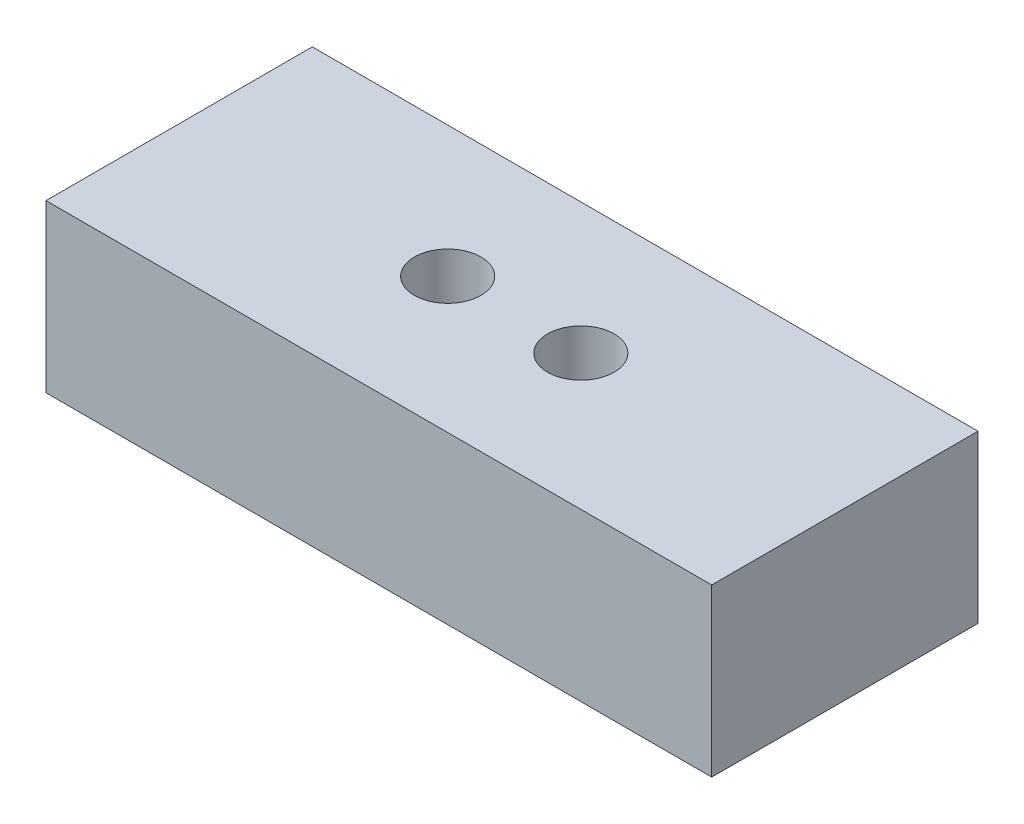
ISO-10303-21;
HEADER;
FILE_DESCRIPTION(('STEP AP214'),'2;1');
FILE_NAME('part.step','',(''),(''),'','','');
FILE_SCHEMA(('AUTOMOTIVE_DESIGN { 1 0 10303 214 1 1 1 1 }'));
ENDSEC;
DATA;
#1=APPLICATION_CONTEXT('core data for automotive mechanical design processes');
#2=APPLICATION_PROTOCOL_DEFINITION('international standard','automotive_design',2000,#1);
#3=PRODUCT_CONTEXT('',#1,'mechanical');
#4=PRODUCT('Part','Part','',(#3));
#5=PRODUCT_RELATED_PRODUCT_CATEGORY('part','',(#4));
#6=PRODUCT_DEFINITION_FORMATION('','',#4);
#7=PRODUCT_DEFINITION_CONTEXT('part definition',#1,'design');
#8=PRODUCT_DEFINITION('design','',#6,#7);
#9=PRODUCT_DEFINITION_SHAPE('','',#8);
#10=(LENGTH_UNIT() NAMED_UNIT(*) SI_UNIT(.MILLI.,.METRE.));
#11=(NAMED_UNIT(*) PLANE_ANGLE_UNIT() SI_UNIT($,.RADIAN.));
#12=(NAMED_UNIT(*) SI_UNIT($,.STERADIAN.) SOLID_ANGLE_UNIT());
#13=UNCERTAINTY_MEASURE_WITH_UNIT(LENGTH_MEASURE(1.E-05),#10,'distance_accuracy_value','');
#14=(GEOMETRIC_REPRESENTATION_CONTEXT(3) GLOBAL_UNCERTAINTY_ASSIGNED_CONTEXT((#13)) GLOBAL_UNIT_ASSIGNED_CONTEXT((#10,
#11,#12)) REPRESENTATION_CONTEXT('',''));
#15=CARTESIAN_POINT('',(0.,0.,0.));
#16=DIRECTION('',(0.,0.,1.));
#17=DIRECTION('',(1.,0.,0.));
#18=AXIS2_PLACEMENT_3D('',#15,#16,#17);
#19=CARTESIAN_POINT('',(-95.886524822695,25.,-18.2978723404255));
#20=DIRECTION('',(1.,0.,0.));
#21=DIRECTION('',(0.,0.,-1.));
#22=AXIS2_PLACEMENT_3D('',#19,#20,#21);
#23=PLANE('',#22);
#24=DIRECTION('',(0.,0.,1.));
#25=VECTOR('',#24,1.);
#26=CARTESIAN_POINT('',(-95.886524822695,0.,-18.2978723404255));
#27=LINE('',#26,#25);
#28=CARTESIAN_POINT('',(-95.886524822695,0.,-18.2978723404255));
#29=VERTEX_POINT('',#28);
#30=CARTESIAN_POINT('',(-95.886524822695,0.,21.7021276595745));
#31=VERTEX_POINT('',#30);
#32=EDGE_CURVE('E110',#29,#31,#27,.T.);
#33=ORIENTED_EDGE('',*,*,#32,.T.);
#34=DIRECTION('',(0.,-1.,0.));
#35=VECTOR('',#34,1.);
#36=CARTESIAN_POINT('',(-95.886524822695,25.,21.7021276595745));
#37=LINE('',#36,#35);
#38=CARTESIAN_POINT('',(-95.886524822695,25.,21.7021276595745));
#39=VERTEX_POINT('',#38);
#40=EDGE_CURVE('E11',#39,#31,#37,.T.);
#41=ORIENTED_EDGE('',*,*,#40,.F.);
#42=DIRECTION('',(0.,0.,1.));
#43=VECTOR('',#42,1.);
#44=CARTESIAN_POINT('',(-95.886524822695,25.,-18.2978723404255));
#45=LINE('',#44,#43);
#46=CARTESIAN_POINT('',(-95.886524822695,25.,-18.2978723404255));
#47=VERTEX_POINT('',#46);
#48=EDGE_CURVE('E94',#47,#39,#45,.T.);
#49=ORIENTED_EDGE('',*,*,#48,.F.);
#50=DIRECTION('',(0.,-1.,0.));
#51=VECTOR('',#50,1.);
#52=CARTESIAN_POINT('',(-95.886524822695,25.,-18.2978723404255));
#53=LINE('',#52,#51);
#54=EDGE_CURVE('E106',#47,#29,#53,.T.);
#55=ORIENTED_EDGE('',*,*,#54,.T.);
#56=EDGE_LOOP('',(#33,#41,#49,#55));
#57=FACE_BOUND('',#56,.T.);
#58=ADVANCED_FACE('F42',(#57),#23,.F.);
#59=CARTESIAN_POINT('',(-95.886524822695,25.,21.7021276595745));
#60=DIRECTION('',(0.,0.,-1.));
#61=DIRECTION('',(-1.,0.,0.));
#62=AXIS2_PLACEMENT_3D('',#59,#60,#61);
#63=PLANE('',#62);
#64=DIRECTION('',(1.,0.,0.));
#65=VECTOR('',#64,1.);
#66=CARTESIAN_POINT('',(-95.886524822695,0.,21.7021276595745));
#67=LINE('',#66,#65);
#68=CARTESIAN_POINT('',(4.11347517730497,0.,21.7021276595745));
#69=VERTEX_POINT('',#68);
#70=EDGE_CURVE('E99',#31,#69,#67,.T.);
#71=ORIENTED_EDGE('',*,*,#70,.T.);
#72=DIRECTION('',(0.,-1.,0.));
#73=VECTOR('',#72,1.);
#74=CARTESIAN_POINT('',(4.11347517730497,25.,21.7021276595745));
#75=LINE('',#74,#73);
#76=CARTESIAN_POINT('',(4.11347517730497,25.,21.7021276595745));
#77=VERTEX_POINT('',#76);
#78=EDGE_CURVE('E51',#77,#69,#75,.T.);
#79=ORIENTED_EDGE('',*,*,#78,.F.);
#80=DIRECTION('',(1.,0.,0.));
#81=VECTOR('',#80,1.);
#82=CARTESIAN_POINT('',(-95.886524822695,25.,21.7021276595745));
#83=LINE('',#82,#81);
#84=EDGE_CURVE('E89',#39,#77,#83,.T.);
#85=ORIENTED_EDGE('',*,*,#84,.F.);
#86=ORIENTED_EDGE('',*,*,#40,.T.);
#87=EDGE_LOOP('',(#71,#79,#85,#86));
#88=FACE_BOUND('',#87,.T.);
#89=ADVANCED_FACE('F98',(#88),#63,.F.);
#90=CARTESIAN_POINT('',(4.11347517730497,25.,-18.2978723404255));
#91=DIRECTION('',(-1.,0.,0.));
#92=DIRECTION('',(0.,0.,1.));
#93=AXIS2_PLACEMENT_3D('',#90,#91,#92);
#94=PLANE('',#93);
#95=DIRECTION('',(0.,0.,-1.));
#96=VECTOR('',#95,1.);
#97=CARTESIAN_POINT('',(4.11347517730497,0.,-18.2978723404255));
#98=LINE('',#97,#96);
#99=CARTESIAN_POINT('',(4.11347517730497,0.,-18.2978723404255));
#100=VERTEX_POINT('',#99);
#101=EDGE_CURVE('E76',#69,#100,#98,.T.);
#102=ORIENTED_EDGE('',*,*,#101,.T.);
#103=DIRECTION('',(0.,-1.,0.));
#104=VECTOR('',#103,1.);
#105=CARTESIAN_POINT('',(4.11347517730497,25.,-18.2978723404255));
#106=LINE('',#105,#104);
#107=CARTESIAN_POINT('',(4.11347517730497,25.,-18.2978723404255));
#108=VERTEX_POINT('',#107);
#109=EDGE_CURVE('E101',#108,#100,#106,.T.);
#110=ORIENTED_EDGE('',*,*,#109,.F.);
#111=DIRECTION('',(0.,0.,-1.));
#112=VECTOR('',#111,1.);
#113=CARTESIAN_POINT('',(4.11347517730497,25.,-18.2978723404255));
#114=LINE('',#113,#112);
#115=EDGE_CURVE('E92',#77,#108,#114,.T.);
#116=ORIENTED_EDGE('',*,*,#115,.F.);
#117=ORIENTED_EDGE('',*,*,#78,.T.);
#118=EDGE_LOOP('',(#102,#110,#116,#117));
#119=FACE_BOUND('',#118,.T.);
#120=ADVANCED_FACE('F102',(#119),#94,.F.);
#121=CARTESIAN_POINT('',(-95.886524822695,25.,-18.2978723404255));
#122=DIRECTION('',(0.,0.,1.));
#123=DIRECTION('',(1.,0.,0.));
#124=AXIS2_PLACEMENT_3D('',#121,#122,#123);
#125=PLANE('',#124);
#126=DIRECTION('',(-1.,0.,0.));
#127=VECTOR('',#126,1.);
#128=CARTESIAN_POINT('',(-95.886524822695,0.,-18.2978723404255));
#129=LINE('',#128,#127);
#130=EDGE_CURVE('E82',#100,#29,#129,.T.);
#131=ORIENTED_EDGE('',*,*,#130,.T.);
#132=ORIENTED_EDGE('',*,*,#54,.F.);
#133=DIRECTION('',(-1.,0.,0.));
#134=VECTOR('',#133,1.);
#135=CARTESIAN_POINT('',(-95.886524822695,25.,-18.2978723404255));
#136=LINE('',#135,#134);
#137=EDGE_CURVE('E59',#108,#47,#136,.T.);
#138=ORIENTED_EDGE('',*,*,#137,.F.);
#139=ORIENTED_EDGE('',*,*,#109,.T.);
#140=EDGE_LOOP('',(#131,#132,#138,#139));
#141=FACE_BOUND('',#140,.T.);
#142=ADVANCED_FACE('F124',(#141),#125,.F.);
#143=CARTESIAN_POINT('',(0.,25.,0.));
#144=DIRECTION('',(0.,1.,0.));
#145=DIRECTION('',(0.,0.,1.));
#146=AXIS2_PLACEMENT_3D('',#143,#144,#145);
#147=PLANE('',#146);
#148=CARTESIAN_POINT('',(-55.886524822695,25.,1.36175408974849));
#149=DIRECTION('',(0.,1.,0.));
#150=DIRECTION('',(0.,0.,1.));
#151=AXIS2_PLACEMENT_3D('',#148,#149,#150);
#152=CIRCLE('',#151,5.);
#153=CARTESIAN_POINT('',(-55.886524822695,25.,6.36175408974849));
#154=VERTEX_POINT('',#153);
#155=EDGE_CURVE('E139',#154,#154,#152,.T.);
#156=ORIENTED_EDGE('',*,*,#155,.F.);
#157=EDGE_LOOP('',(#156));
#158=FACE_BOUND('',#157,.T.);
#159=CARTESIAN_POINT('',(-35.886524822695,25.,1.36175408974849));
#160=DIRECTION('',(0.,1.,0.));
#161=DIRECTION('',(0.,0.,1.));
#162=AXIS2_PLACEMENT_3D('',#159,#160,#161);
#163=CIRCLE('',#162,5.);
#164=CARTESIAN_POINT('',(-35.886524822695,25.,6.36175408974849));
#165=VERTEX_POINT('',#164);
#166=EDGE_CURVE('E131',#165,#165,#163,.T.);
#167=ORIENTED_EDGE('',*,*,#166,.F.);
#168=EDGE_LOOP('',(#167));
#169=FACE_BOUND('',#168,.T.);
#170=ORIENTED_EDGE('',*,*,#48,.T.);
#171=ORIENTED_EDGE('',*,*,#84,.T.);
#172=ORIENTED_EDGE('',*,*,#115,.T.);
#173=ORIENTED_EDGE('',*,*,#137,.T.);
#174=EDGE_LOOP('',(#170,#171,#172,#173));
#175=FACE_BOUND('',#174,.T.);
#176=ADVANCED_FACE('F90',(#158,#169,#175),#147,.T.);
#177=CARTESIAN_POINT('',(0.,0.,0.));
#178=DIRECTION('',(0.,1.,0.));
#179=DIRECTION('',(0.,0.,1.));
#180=AXIS2_PLACEMENT_3D('',#177,#178,#179);
#181=PLANE('',#180);
#182=ORIENTED_EDGE('',*,*,#32,.F.);
#183=ORIENTED_EDGE('',*,*,#130,.F.);
#184=ORIENTED_EDGE('',*,*,#101,.F.);
#185=ORIENTED_EDGE('',*,*,#70,.F.);
#186=EDGE_LOOP('',(#182,#183,#184,#185));
#187=FACE_BOUND('',#186,.T.);
#188=ADVANCED_FACE('F127',(#187),#181,.F.);
#189=CARTESIAN_POINT('',(-35.886524822695,15.,1.36175408974849));
#190=DIRECTION('',(0.,1.,0.));
#191=DIRECTION('',(0.,0.,1.));
#192=AXIS2_PLACEMENT_3D('',#189,#190,#191);
#193=CYLINDRICAL_SURFACE('',#192,5.);
#194=CARTESIAN_POINT('',(-35.886524822695,15.,1.36175408974849));
#195=DIRECTION('',(0.,1.,0.));
#196=DIRECTION('',(0.,0.,1.));
#197=AXIS2_PLACEMENT_3D('',#194,#195,#196);
#198=CIRCLE('',#197,5.);
#199=CARTESIAN_POINT('',(-35.886524822695,15.,6.36175408974849));
#200=VERTEX_POINT('',#199);
#201=EDGE_CURVE('E135',#200,#200,#198,.T.);
#202=ORIENTED_EDGE('',*,*,#201,.F.);
#203=EDGE_LOOP('',(#202));
#204=FACE_BOUND('',#203,.T.);
#205=ORIENTED_EDGE('',*,*,#166,.T.);
#206=EDGE_LOOP('',(#205));
#207=FACE_BOUND('',#206,.T.);
#208=ADVANCED_FACE('F161',(#204,#207),#193,.F.);
#209=CARTESIAN_POINT('',(-35.886524822695,15.,1.36175408974849));
#210=DIRECTION('',(0.,1.,0.));
#211=DIRECTION('',(0.,0.,1.));
#212=AXIS2_PLACEMENT_3D('',#209,#210,#211);
#213=PLANE('',#212);
#214=ORIENTED_EDGE('',*,*,#201,.T.);
#215=EDGE_LOOP('',(#214));
#216=FACE_BOUND('',#215,.T.);
#217=ADVANCED_FACE('F152',(#216),#213,.T.);
#218=CARTESIAN_POINT('',(-55.886524822695,15.,1.36175408974849));
#219=DIRECTION('',(0.,1.,0.));
#220=DIRECTION('',(0.,0.,1.));
#221=AXIS2_PLACEMENT_3D('',#218,#219,#220);
#222=CYLINDRICAL_SURFACE('',#221,5.);
#223=CARTESIAN_POINT('',(-55.886524822695,15.,1.36175408974849));
#224=DIRECTION('',(0.,1.,0.));
#225=DIRECTION('',(0.,0.,1.));
#226=AXIS2_PLACEMENT_3D('',#223,#224,#225);
#227=CIRCLE('',#226,5.);
#228=CARTESIAN_POINT('',(-55.886524822695,15.,6.36175408974849));
#229=VERTEX_POINT('',#228);
#230=EDGE_CURVE('E114',#229,#229,#227,.T.);
#231=ORIENTED_EDGE('',*,*,#230,.F.);
#232=EDGE_LOOP('',(#231));
#233=FACE_BOUND('',#232,.T.);
#234=ORIENTED_EDGE('',*,*,#155,.T.);
#235=EDGE_LOOP('',(#234));
#236=FACE_BOUND('',#235,.T.);
#237=ADVANCED_FACE('F149',(#233,#236),#222,.F.);
#238=CARTESIAN_POINT('',(-55.886524822695,15.,1.36175408974849));
#239=DIRECTION('',(0.,1.,0.));
#240=DIRECTION('',(0.,0.,1.));
#241=AXIS2_PLACEMENT_3D('',#238,#239,#240);
#242=PLANE('',#241);
#243=ORIENTED_EDGE('',*,*,#230,.T.);
#244=EDGE_LOOP('',(#243));
#245=FACE_BOUND('',#244,.T.);
#246=ADVANCED_FACE('F147',(#245),#242,.T.);
#247=CLOSED_SHELL('',(#58,#89,#120,#142,#176,#188,#208,#217,#237,#246));
#248=MANIFOLD_SOLID_BREP('B2',#247);
#249=ADVANCED_BREP_SHAPE_REPRESENTATION('',(#18,#248),#14);
#250=SHAPE_DEFINITION_REPRESENTATION(#9,#249);
ENDSEC;
END-ISO-10303-21;
